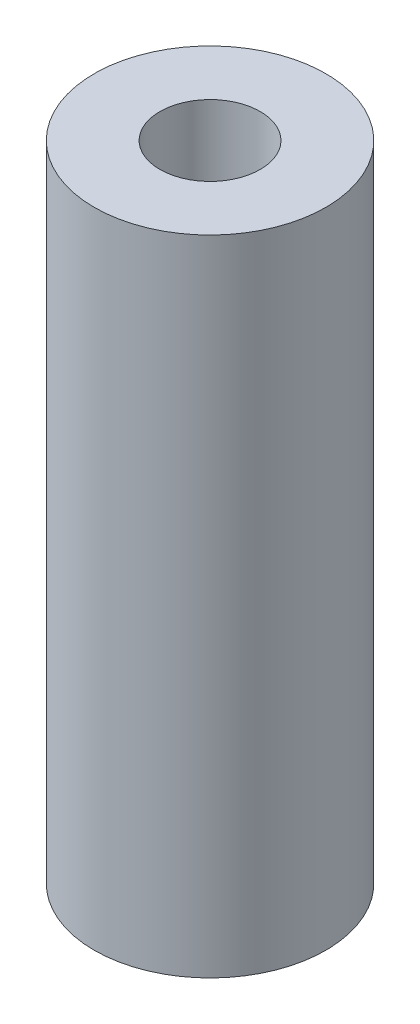
ISO-10303-21;
HEADER;
FILE_DESCRIPTION(('STEP AP214'),'2;1');
FILE_NAME('part.step','',(''),(''),'','','');
FILE_SCHEMA(('AUTOMOTIVE_DESIGN { 1 0 10303 214 1 1 1 1 }'));
ENDSEC;
DATA;
#1=APPLICATION_CONTEXT('core data for automotive mechanical design processes');
#2=APPLICATION_PROTOCOL_DEFINITION('international standard','automotive_design',2000,#1);
#3=PRODUCT_CONTEXT('',#1,'mechanical');
#4=PRODUCT('Part','Part','',(#3));
#5=PRODUCT_RELATED_PRODUCT_CATEGORY('part','',(#4));
#6=PRODUCT_DEFINITION_FORMATION('','',#4);
#7=PRODUCT_DEFINITION_CONTEXT('part definition',#1,'design');
#8=PRODUCT_DEFINITION('design','',#6,#7);
#9=PRODUCT_DEFINITION_SHAPE('','',#8);
#10=(LENGTH_UNIT() NAMED_UNIT(*) SI_UNIT(.MILLI.,.METRE.));
#11=(NAMED_UNIT(*) PLANE_ANGLE_UNIT() SI_UNIT($,.RADIAN.));
#12=(NAMED_UNIT(*) SI_UNIT($,.STERADIAN.) SOLID_ANGLE_UNIT());
#13=UNCERTAINTY_MEASURE_WITH_UNIT(LENGTH_MEASURE(1.E-05),#10,'distance_accuracy_value','');
#14=(GEOMETRIC_REPRESENTATION_CONTEXT(3) GLOBAL_UNCERTAINTY_ASSIGNED_CONTEXT((#13)) GLOBAL_UNIT_ASSIGNED_CONTEXT((#10,
#11,#12)) REPRESENTATION_CONTEXT('',''));
#15=CARTESIAN_POINT('',(0.,0.,0.));
#16=DIRECTION('',(0.,0.,1.));
#17=DIRECTION('',(1.,0.,0.));
#18=AXIS2_PLACEMENT_3D('',#15,#16,#17);
#19=CARTESIAN_POINT('',(0.,0.,0.));
#20=DIRECTION('',(0.,1.,0.));
#21=DIRECTION('',(0.,0.,1.));
#22=AXIS2_PLACEMENT_3D('',#19,#20,#21);
#23=PLANE('',#22);
#24=CARTESIAN_POINT('',(0.,0.,0.));
#25=DIRECTION('',(0.,1.,0.));
#26=DIRECTION('',(0.,0.,1.));
#27=AXIS2_PLACEMENT_3D('',#24,#25,#26);
#28=CIRCLE('',#27,4.5);
#29=CARTESIAN_POINT('',(0.,0.,4.5));
#30=VERTEX_POINT('',#29);
#31=EDGE_CURVE('E10',#30,#30,#28,.T.);
#32=ORIENTED_EDGE('',*,*,#31,.F.);
#33=EDGE_LOOP('',(#32));
#34=FACE_BOUND('',#33,.T.);
#35=CARTESIAN_POINT('',(0.,0.,0.));
#36=DIRECTION('',(0.,1.,0.));
#37=DIRECTION('',(0.,0.,1.));
#38=AXIS2_PLACEMENT_3D('',#35,#36,#37);
#39=CIRCLE('',#38,2.05);
#40=CARTESIAN_POINT('',(0.,0.,2.05));
#41=VERTEX_POINT('',#40);
#42=EDGE_CURVE('E42',#41,#41,#39,.T.);
#43=ORIENTED_EDGE('',*,*,#42,.T.);
#44=EDGE_LOOP('',(#43));
#45=FACE_BOUND('',#44,.T.);
#46=ADVANCED_FACE('F35',(#34,#45),#23,.F.);
#47=CARTESIAN_POINT('',(0.,10.,0.));
#48=DIRECTION('',(0.,-1.,0.));
#49=DIRECTION('',(0.,0.,-1.));
#50=AXIS2_PLACEMENT_3D('',#47,#48,#49);
#51=CYLINDRICAL_SURFACE('',#50,4.5);
#52=ORIENTED_EDGE('',*,*,#31,.T.);
#53=EDGE_LOOP('',(#52));
#54=FACE_BOUND('',#53,.T.);
#55=CARTESIAN_POINT('',(0.,25.,0.));
#56=DIRECTION('',(0.,1.,0.));
#57=DIRECTION('',(0.,0.,1.));
#58=AXIS2_PLACEMENT_3D('',#55,#56,#57);
#59=CIRCLE('',#58,4.5);
#60=CARTESIAN_POINT('',(0.,25.,4.5));
#61=VERTEX_POINT('',#60);
#62=EDGE_CURVE('E50',#61,#61,#59,.T.);
#63=ORIENTED_EDGE('',*,*,#62,.F.);
#64=EDGE_LOOP('',(#63));
#65=FACE_BOUND('',#64,.T.);
#66=ADVANCED_FACE('F37',(#54,#65),#51,.T.);
#67=CARTESIAN_POINT('',(0.,10.,0.));
#68=DIRECTION('',(0.,-1.,0.));
#69=DIRECTION('',(0.,0.,-1.));
#70=AXIS2_PLACEMENT_3D('',#67,#68,#69);
#71=CYLINDRICAL_SURFACE('',#70,2.05);
#72=CARTESIAN_POINT('',(0.,10.,0.));
#73=DIRECTION('',(0.,1.,0.));
#74=DIRECTION('',(0.,0.,1.));
#75=AXIS2_PLACEMENT_3D('',#72,#73,#74);
#76=CIRCLE('',#75,2.05);
#77=CARTESIAN_POINT('',(0.,10.,2.05));
#78=VERTEX_POINT('',#77);
#79=EDGE_CURVE('E46',#78,#78,#76,.T.);
#80=ORIENTED_EDGE('',*,*,#79,.T.);
#81=EDGE_LOOP('',(#80));
#82=FACE_BOUND('',#81,.T.);
#83=ORIENTED_EDGE('',*,*,#42,.F.);
#84=EDGE_LOOP('',(#83));
#85=FACE_BOUND('',#84,.T.);
#86=ADVANCED_FACE('F75',(#82,#85),#71,.F.);
#87=CARTESIAN_POINT('',(0.,10.,0.));
#88=DIRECTION('',(0.,1.,0.));
#89=DIRECTION('',(0.,0.,1.));
#90=AXIS2_PLACEMENT_3D('',#87,#88,#89);
#91=PLANE('',#90);
#92=CARTESIAN_POINT('',(0.,10.,0.));
#93=DIRECTION('',(0.,1.,0.));
#94=DIRECTION('',(0.,0.,1.));
#95=AXIS2_PLACEMENT_3D('',#92,#93,#94);
#96=CIRCLE('',#95,1.95);
#97=CARTESIAN_POINT('',(0.,10.,1.95));
#98=VERTEX_POINT('',#97);
#99=EDGE_CURVE('E56',#98,#98,#96,.T.);
#100=ORIENTED_EDGE('',*,*,#99,.T.);
#101=EDGE_LOOP('',(#100));
#102=FACE_BOUND('',#101,.T.);
#103=ORIENTED_EDGE('',*,*,#79,.F.);
#104=EDGE_LOOP('',(#103));
#105=FACE_BOUND('',#104,.T.);
#106=ADVANCED_FACE('F67',(#102,#105),#91,.F.);
#107=CARTESIAN_POINT('',(0.,25.,0.));
#108=DIRECTION('',(0.,1.,0.));
#109=DIRECTION('',(0.,0.,1.));
#110=AXIS2_PLACEMENT_3D('',#107,#108,#109);
#111=PLANE('',#110);
#112=ORIENTED_EDGE('',*,*,#62,.T.);
#113=EDGE_LOOP('',(#112));
#114=FACE_BOUND('',#113,.T.);
#115=CARTESIAN_POINT('',(0.,25.,0.));
#116=DIRECTION('',(0.,1.,0.));
#117=DIRECTION('',(0.,0.,1.));
#118=AXIS2_PLACEMENT_3D('',#115,#116,#117);
#119=CIRCLE('',#118,1.95);
#120=CARTESIAN_POINT('',(0.,25.,1.95));
#121=VERTEX_POINT('',#120);
#122=EDGE_CURVE('E55',#121,#121,#119,.T.);
#123=ORIENTED_EDGE('',*,*,#122,.F.);
#124=EDGE_LOOP('',(#123));
#125=FACE_BOUND('',#124,.T.);
#126=ADVANCED_FACE('F65',(#114,#125),#111,.T.);
#127=CARTESIAN_POINT('',(0.,25.,0.));
#128=DIRECTION('',(0.,-1.,0.));
#129=DIRECTION('',(0.,0.,-1.));
#130=AXIS2_PLACEMENT_3D('',#127,#128,#129);
#131=CYLINDRICAL_SURFACE('',#130,1.95);
#132=ORIENTED_EDGE('',*,*,#122,.T.);
#133=EDGE_LOOP('',(#132));
#134=FACE_BOUND('',#133,.T.);
#135=ORIENTED_EDGE('',*,*,#99,.F.);
#136=EDGE_LOOP('',(#135));
#137=FACE_BOUND('',#136,.T.);
#138=ADVANCED_FACE('F62',(#134,#137),#131,.F.);
#139=CLOSED_SHELL('',(#46,#66,#86,#106,#126,#138));
#140=MANIFOLD_SOLID_BREP('B2',#139);
#141=ADVANCED_BREP_SHAPE_REPRESENTATION('',(#18,#140),#14);
#142=SHAPE_DEFINITION_REPRESENTATION(#9,#141);
ENDSEC;
END-ISO-10303-21;
